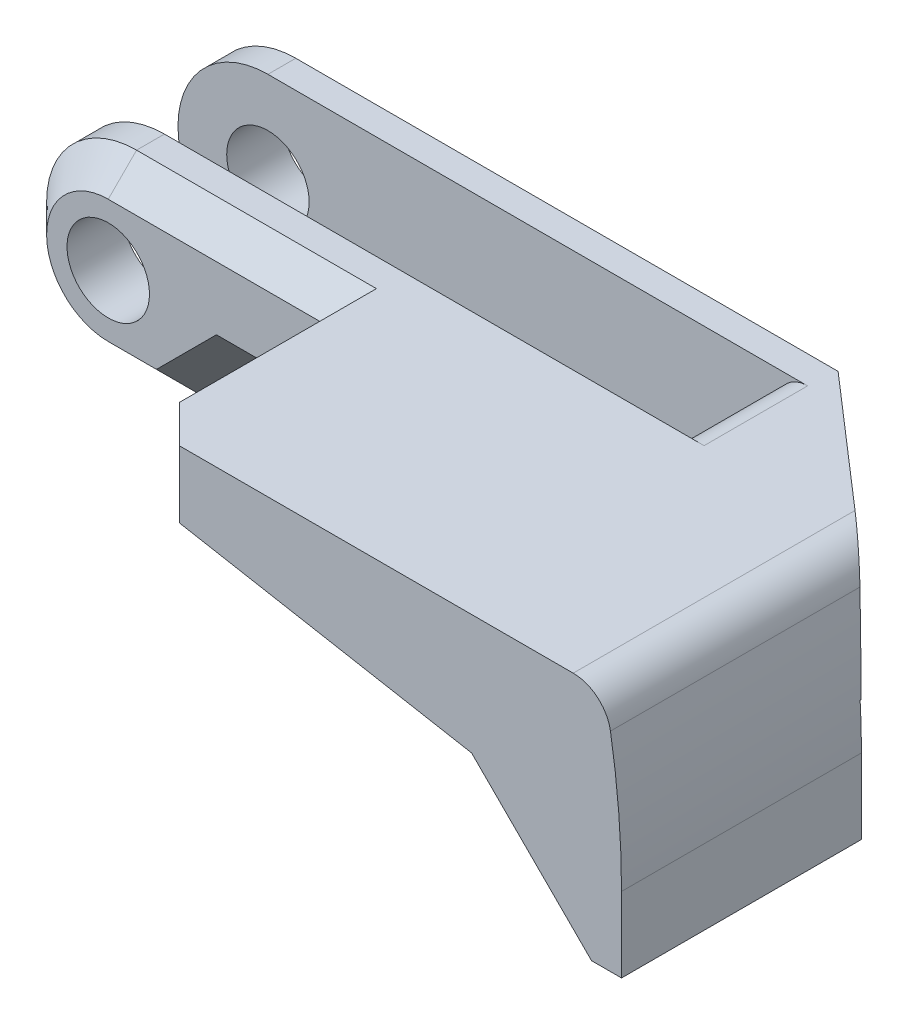
ISO-10303-21;
HEADER;
FILE_DESCRIPTION(('STEP AP214'),'2;1');
FILE_NAME('part.step','',(''),(''),'','','');
FILE_SCHEMA(('AUTOMOTIVE_DESIGN { 1 0 10303 214 1 1 1 1 }'));
ENDSEC;
DATA;
#1=APPLICATION_CONTEXT('core data for automotive mechanical design processes');
#2=APPLICATION_PROTOCOL_DEFINITION('international standard','automotive_design',2000,#1);
#3=PRODUCT_CONTEXT('',#1,'mechanical');
#4=PRODUCT('Part','Part','',(#3));
#5=PRODUCT_RELATED_PRODUCT_CATEGORY('part','',(#4));
#6=PRODUCT_DEFINITION_FORMATION('','',#4);
#7=PRODUCT_DEFINITION_CONTEXT('part definition',#1,'design');
#8=PRODUCT_DEFINITION('design','',#6,#7);
#9=PRODUCT_DEFINITION_SHAPE('','',#8);
#10=(LENGTH_UNIT() NAMED_UNIT(*) SI_UNIT(.MILLI.,.METRE.));
#11=(NAMED_UNIT(*) PLANE_ANGLE_UNIT() SI_UNIT($,.RADIAN.));
#12=(NAMED_UNIT(*) SI_UNIT($,.STERADIAN.) SOLID_ANGLE_UNIT());
#13=UNCERTAINTY_MEASURE_WITH_UNIT(LENGTH_MEASURE(1.E-05),#10,'distance_accuracy_value','');
#14=(GEOMETRIC_REPRESENTATION_CONTEXT(3) GLOBAL_UNCERTAINTY_ASSIGNED_CONTEXT((#13)) GLOBAL_UNIT_ASSIGNED_CONTEXT((#10,
#11,#12)) REPRESENTATION_CONTEXT('',''));
#15=CARTESIAN_POINT('',(0.,0.,0.));
#16=DIRECTION('',(0.,0.,1.));
#17=DIRECTION('',(1.,0.,0.));
#18=AXIS2_PLACEMENT_3D('',#15,#16,#17);
#19=CARTESIAN_POINT('',(0.,0.,11.43));
#20=DIRECTION('',(0.,0.,-1.));
#21=DIRECTION('',(-1.,0.,0.));
#22=AXIS2_PLACEMENT_3D('',#19,#20,#21);
#23=CYLINDRICAL_SURFACE('',#22,4.7625);
#24=CARTESIAN_POINT('',(0.,0.,2.975));
#25=DIRECTION('',(0.,0.,-1.));
#26=DIRECTION('',(-1.,0.,0.));
#27=AXIS2_PLACEMENT_3D('',#24,#25,#26);
#28=CIRCLE('',#27,4.7625);
#29=CARTESIAN_POINT('',(0.,-4.7625,2.975));
#30=VERTEX_POINT('',#29);
#31=CARTESIAN_POINT('',(0.,4.7625,2.975));
#32=VERTEX_POINT('',#31);
#33=EDGE_CURVE('E264',#30,#32,#28,.T.);
#34=ORIENTED_EDGE('',*,*,#33,.T.);
#35=DIRECTION('',(0.,0.,-1.));
#36=VECTOR('',#35,1.);
#37=CARTESIAN_POINT('',(0.,4.7625,11.43));
#38=LINE('',#37,#36);
#39=CARTESIAN_POINT('',(0.,4.7625,1.5));
#40=VERTEX_POINT('',#39);
#41=EDGE_CURVE('E342',#32,#40,#38,.T.);
#42=ORIENTED_EDGE('',*,*,#41,.T.);
#43=CARTESIAN_POINT('',(0.,0.,1.5));
#44=DIRECTION('',(0.,0.,1.));
#45=DIRECTION('',(1.,0.,0.));
#46=AXIS2_PLACEMENT_3D('',#43,#44,#45);
#47=CIRCLE('',#46,4.7625);
#48=CARTESIAN_POINT('',(0.,-4.7625,1.5));
#49=VERTEX_POINT('',#48);
#50=EDGE_CURVE('E426',#40,#49,#47,.T.);
#51=ORIENTED_EDGE('',*,*,#50,.T.);
#52=DIRECTION('',(0.,0.,-1.));
#53=VECTOR('',#52,1.);
#54=CARTESIAN_POINT('',(0.,-4.7625,11.43));
#55=LINE('',#54,#53);
#56=EDGE_CURVE('E358',#30,#49,#55,.T.);
#57=ORIENTED_EDGE('',*,*,#56,.F.);
#58=EDGE_LOOP('',(#34,#42,#51,#57));
#59=FACE_BOUND('',#58,.T.);
#60=ADVANCED_FACE('F34',(#59),#23,.T.);
#61=CARTESIAN_POINT('',(0.,-4.7625,11.43));
#62=DIRECTION('',(0.,1.,0.));
#63=DIRECTION('',(0.,0.,1.));
#64=AXIS2_PLACEMENT_3D('',#61,#62,#63);
#65=PLANE('',#64);
#66=DIRECTION('',(0.,0.,-1.));
#67=VECTOR('',#66,1.);
#68=CARTESIAN_POINT('',(3.175,-4.7625,11.43));
#69=LINE('',#68,#67);
#70=CARTESIAN_POINT('',(3.175,-4.7625,2.975));
#71=VERTEX_POINT('',#70);
#72=CARTESIAN_POINT('',(3.175,-4.7625,1.5));
#73=VERTEX_POINT('',#72);
#74=EDGE_CURVE('E354',#71,#73,#69,.T.);
#75=ORIENTED_EDGE('',*,*,#74,.F.);
#76=DIRECTION('',(-1.,0.,0.));
#77=VECTOR('',#76,1.);
#78=CARTESIAN_POINT('',(0.,-4.7625,2.975));
#79=LINE('',#78,#77);
#80=EDGE_CURVE('E261',#71,#30,#79,.T.);
#81=ORIENTED_EDGE('',*,*,#80,.T.);
#82=ORIENTED_EDGE('',*,*,#56,.T.);
#83=DIRECTION('',(1.,0.,0.));
#84=VECTOR('',#83,1.);
#85=CARTESIAN_POINT('',(0.,-4.7625,1.5));
#86=LINE('',#85,#84);
#87=EDGE_CURVE('E431',#49,#73,#86,.T.);
#88=ORIENTED_EDGE('',*,*,#87,.T.);
#89=EDGE_LOOP('',(#75,#81,#82,#88));
#90=FACE_BOUND('',#89,.T.);
#91=ADVANCED_FACE('F480',(#90),#65,.F.);
#92=CARTESIAN_POINT('',(3.175,-4.7625,11.43));
#93=DIRECTION('',(-0.707106781186548,0.707106781186547,0.));
#94=DIRECTION('',(-0.707106781186547,-0.707106781186548,0.));
#95=AXIS2_PLACEMENT_3D('',#92,#93,#94);
#96=PLANE('',#95);
#97=DIRECTION('',(0.,0.,-1.));
#98=VECTOR('',#97,1.);
#99=CARTESIAN_POINT('',(6.35,-1.5875,11.43));
#100=LINE('',#99,#98);
#101=CARTESIAN_POINT('',(6.35,-1.5875,2.975));
#102=VERTEX_POINT('',#101);
#103=CARTESIAN_POINT('',(6.35,-1.5875,0.));
#104=VERTEX_POINT('',#103);
#105=EDGE_CURVE('E350',#102,#104,#100,.T.);
#106=ORIENTED_EDGE('',*,*,#105,.F.);
#107=DIRECTION('',(-0.707106781186547,-0.707106781186548,0.));
#108=VECTOR('',#107,1.);
#109=CARTESIAN_POINT('',(3.175,-4.7625,2.975));
#110=LINE('',#109,#108);
#111=EDGE_CURVE('E258',#102,#71,#110,.T.);
#112=ORIENTED_EDGE('',*,*,#111,.T.);
#113=ORIENTED_EDGE('',*,*,#74,.T.);
#114=DIRECTION('',(-0.577350269189626,-0.577350269189626,0.577350269189625));
#115=VECTOR('',#114,1.);
#116=CARTESIAN_POINT('',(2.11666666666667,-5.82083333333333,2.55833333333333));
#117=LINE('',#116,#115);
#118=CARTESIAN_POINT('',(4.675,-3.2625,0.));
#119=VERTEX_POINT('',#118);
#120=EDGE_CURVE('E436',#73,#119,#117,.F.);
#121=ORIENTED_EDGE('',*,*,#120,.T.);
#122=DIRECTION('',(0.707106781186547,0.707106781186548,0.));
#123=VECTOR('',#122,1.);
#124=CARTESIAN_POINT('',(3.175,-4.7625,0.));
#125=LINE('',#124,#123);
#126=EDGE_CURVE('E335',#119,#104,#125,.T.);
#127=ORIENTED_EDGE('',*,*,#126,.T.);
#128=EDGE_LOOP('',(#106,#112,#113,#121,#127));
#129=FACE_BOUND('',#128,.T.);
#130=ADVANCED_FACE('F497',(#129),#96,.F.);
#131=CARTESIAN_POINT('',(0.,0.,11.43));
#132=DIRECTION('',(0.,0.,1.));
#133=DIRECTION('',(1.,0.,0.));
#134=AXIS2_PLACEMENT_3D('',#131,#132,#133);
#135=CYLINDRICAL_SURFACE('',#134,2.182876);
#136=CARTESIAN_POINT('',(0.,0.,2.975));
#137=DIRECTION('',(0.,0.,-1.));
#138=DIRECTION('',(-1.,0.,0.));
#139=AXIS2_PLACEMENT_3D('',#136,#137,#138);
#140=CIRCLE('',#139,2.182876);
#141=CARTESIAN_POINT('',(-2.182876,0.,2.975));
#142=VERTEX_POINT('',#141);
#143=EDGE_CURVE('E257',#142,#142,#140,.F.);
#144=ORIENTED_EDGE('',*,*,#143,.T.);
#145=EDGE_LOOP('',(#144));
#146=FACE_BOUND('',#145,.T.);
#147=CARTESIAN_POINT('',(0.,0.,0.));
#148=DIRECTION('',(0.,0.,1.));
#149=DIRECTION('',(1.,0.,0.));
#150=AXIS2_PLACEMENT_3D('',#147,#148,#149);
#151=CIRCLE('',#150,2.182876);
#152=CARTESIAN_POINT('',(2.182876,0.,0.));
#153=VERTEX_POINT('',#152);
#154=EDGE_CURVE('E322',#153,#153,#151,.T.);
#155=ORIENTED_EDGE('',*,*,#154,.F.);
#156=EDGE_LOOP('',(#155));
#157=FACE_BOUND('',#156,.T.);
#158=ADVANCED_FACE('F623',(#146,#157),#135,.F.);
#159=CARTESIAN_POINT('',(38.1,4.7625,11.43));
#160=DIRECTION('',(-1.,0.,0.));
#161=DIRECTION('',(0.,0.,1.));
#162=AXIS2_PLACEMENT_3D('',#159,#160,#161);
#163=PLANE('',#162);
#164=DIRECTION('',(0.,1.,0.));
#165=VECTOR('',#164,1.);
#166=CARTESIAN_POINT('',(38.1,-7.9375,22.352));
#167=LINE('',#166,#165);
#168=CARTESIAN_POINT('',(38.1,-7.9375,22.352));
#169=VERTEX_POINT('',#168);
#170=CARTESIAN_POINT('',(38.1,-3.96875,22.352));
#171=VERTEX_POINT('',#170);
#172=EDGE_CURVE('E285',#169,#171,#167,.T.);
#173=ORIENTED_EDGE('',*,*,#172,.F.);
#174=DIRECTION('',(0.,0.,-1.));
#175=VECTOR('',#174,1.);
#176=CARTESIAN_POINT('',(38.1,-7.9375,11.43));
#177=LINE('',#176,#175);
#178=CARTESIAN_POINT('',(38.1,-7.9375,9.652));
#179=VERTEX_POINT('',#178);
#180=EDGE_CURVE('E346',#169,#179,#177,.T.);
#181=ORIENTED_EDGE('',*,*,#180,.T.);
#182=DIRECTION('',(0.,-1.,0.));
#183=VECTOR('',#182,1.);
#184=CARTESIAN_POINT('',(38.1,-3.96875,9.652));
#185=LINE('',#184,#183);
#186=CARTESIAN_POINT('',(38.1,-3.96874999999999,9.652));
#187=VERTEX_POINT('',#186);
#188=EDGE_CURVE('E301',#187,#179,#185,.T.);
#189=ORIENTED_EDGE('',*,*,#188,.F.);
#190=DIRECTION('',(0.,0.,-1.));
#191=VECTOR('',#190,1.);
#192=CARTESIAN_POINT('',(38.1,-3.96875,24.13));
#193=LINE('',#192,#191);
#194=EDGE_CURVE('E339',#171,#187,#193,.T.);
#195=ORIENTED_EDGE('',*,*,#194,.F.);
#196=EDGE_LOOP('',(#173,#181,#189,#195));
#197=FACE_BOUND('',#196,.T.);
#198=ADVANCED_FACE('F565',(#197),#163,.F.);
#199=CARTESIAN_POINT('',(36.5125,-7.9375,11.43));
#200=DIRECTION('',(0.707106781186547,0.707106781186547,0.));
#201=DIRECTION('',(-0.707106781186548,0.707106781186548,0.));
#202=AXIS2_PLACEMENT_3D('',#199,#200,#201);
#203=PLANE('',#202);
#204=DIRECTION('',(0.707106781186547,-0.707106781186547,0.));
#205=VECTOR('',#204,1.);
#206=CARTESIAN_POINT('',(30.1625,-1.5875,22.352));
#207=LINE('',#206,#205);
#208=CARTESIAN_POINT('',(30.1625,-1.5875,22.352));
#209=VERTEX_POINT('',#208);
#210=CARTESIAN_POINT('',(36.5125,-7.9375,22.352));
#211=VERTEX_POINT('',#210);
#212=EDGE_CURVE('E297',#209,#211,#207,.T.);
#213=ORIENTED_EDGE('',*,*,#212,.F.);
#214=DIRECTION('',(0.,0.,-1.));
#215=VECTOR('',#214,1.);
#216=CARTESIAN_POINT('',(30.1625,-1.5875,24.13));
#217=LINE('',#216,#215);
#218=CARTESIAN_POINT('',(30.1625,-1.5875,9.92999999999999));
#219=VERTEX_POINT('',#218);
#220=EDGE_CURVE('E330',#209,#219,#217,.T.);
#221=ORIENTED_EDGE('',*,*,#220,.T.);
#222=DIRECTION('',(0.,0.,1.));
#223=VECTOR('',#222,1.);
#224=CARTESIAN_POINT('',(30.1625,-1.5875,9.652));
#225=LINE('',#224,#223);
#226=CARTESIAN_POINT('',(30.1625,-1.5875,9.652));
#227=VERTEX_POINT('',#226);
#228=EDGE_CURVE('E315',#227,#219,#225,.T.);
#229=ORIENTED_EDGE('',*,*,#228,.F.);
#230=DIRECTION('',(-0.707106781186548,0.707106781186547,0.));
#231=VECTOR('',#230,1.);
#232=CARTESIAN_POINT('',(36.5125,-7.9375,9.652));
#233=LINE('',#232,#231);
#234=CARTESIAN_POINT('',(36.5125,-7.9375,9.652));
#235=VERTEX_POINT('',#234);
#236=EDGE_CURVE('E307',#235,#227,#233,.T.);
#237=ORIENTED_EDGE('',*,*,#236,.F.);
#238=DIRECTION('',(0.,0.,-1.));
#239=VECTOR('',#238,1.);
#240=CARTESIAN_POINT('',(36.5125,-7.9375,11.43));
#241=LINE('',#240,#239);
#242=EDGE_CURVE('E348',#211,#235,#241,.T.);
#243=ORIENTED_EDGE('',*,*,#242,.F.);
#244=EDGE_LOOP('',(#213,#221,#229,#237,#243));
#245=FACE_BOUND('',#244,.T.);
#246=ADVANCED_FACE('F549',(#245),#203,.F.);
#247=CARTESIAN_POINT('',(38.1,-7.9375,11.43));
#248=DIRECTION('',(0.,1.,0.));
#249=DIRECTION('',(0.,0.,1.));
#250=AXIS2_PLACEMENT_3D('',#247,#248,#249);
#251=PLANE('',#250);
#252=DIRECTION('',(1.,0.,0.));
#253=VECTOR('',#252,1.);
#254=CARTESIAN_POINT('',(36.5125,-7.9375,22.352));
#255=LINE('',#254,#253);
#256=EDGE_CURVE('E283',#211,#169,#255,.T.);
#257=ORIENTED_EDGE('',*,*,#256,.F.);
#258=ORIENTED_EDGE('',*,*,#242,.T.);
#259=DIRECTION('',(-1.,0.,0.));
#260=VECTOR('',#259,1.);
#261=CARTESIAN_POINT('',(38.1,-7.9375,9.652));
#262=LINE('',#261,#260);
#263=EDGE_CURVE('E304',#179,#235,#262,.T.);
#264=ORIENTED_EDGE('',*,*,#263,.F.);
#265=ORIENTED_EDGE('',*,*,#180,.F.);
#266=EDGE_LOOP('',(#257,#258,#264,#265));
#267=FACE_BOUND('',#266,.T.);
#268=ADVANCED_FACE('F570',(#267),#251,.F.);
#269=CARTESIAN_POINT('',(0.,4.7625,11.43));
#270=DIRECTION('',(0.,-1.,0.));
#271=DIRECTION('',(0.,0.,-1.));
#272=AXIS2_PLACEMENT_3D('',#269,#270,#271);
#273=PLANE('',#272);
#274=DIRECTION('',(0.,0.,-1.));
#275=VECTOR('',#274,1.);
#276=CARTESIAN_POINT('',(12.7,4.7625,24.13));
#277=LINE('',#276,#275);
#278=CARTESIAN_POINT('',(12.7,4.7625,20.352));
#279=VERTEX_POINT('',#278);
#280=CARTESIAN_POINT('',(12.7,4.7625,9.92999999999999));
#281=VERTEX_POINT('',#280);
#282=EDGE_CURVE('E334',#279,#281,#277,.T.);
#283=ORIENTED_EDGE('',*,*,#282,.F.);
#284=DIRECTION('',(-0.707106781186546,0.,-0.707106781186549));
#285=VECTOR('',#284,1.);
#286=CARTESIAN_POINT('',(14.7,4.7625,22.352));
#287=LINE('',#286,#285);
#288=CARTESIAN_POINT('',(14.7,4.7625,22.352));
#289=VERTEX_POINT('',#288);
#290=EDGE_CURVE('E11',#279,#289,#287,.F.);
#291=ORIENTED_EDGE('',*,*,#290,.T.);
#292=DIRECTION('',(-1.,0.,0.));
#293=VECTOR('',#292,1.);
#294=CARTESIAN_POINT('',(35.541769993234,4.7625,22.352));
#295=LINE('',#294,#293);
#296=CARTESIAN_POINT('',(35.541769993234,4.7625,22.352));
#297=VERTEX_POINT('',#296);
#298=EDGE_CURVE('E292',#297,#289,#295,.T.);
#299=ORIENTED_EDGE('',*,*,#298,.F.);
#300=DIRECTION('',(0.,0.,-1.));
#301=VECTOR('',#300,1.);
#302=CARTESIAN_POINT('',(35.541769993234,4.7625,11.43));
#303=LINE('',#302,#301);
#304=CARTESIAN_POINT('',(35.541769993234,4.7625,7.42999450840892));
#305=VERTEX_POINT('',#304);
#306=EDGE_CURVE('E362',#297,#305,#303,.T.);
#307=ORIENTED_EDGE('',*,*,#306,.T.);
#308=DIRECTION('',(0.754976910693908,0.,0.655751373859852));
#309=VECTOR('',#308,1.);
#310=CARTESIAN_POINT('',(26.9875,4.7625,0.));
#311=LINE('',#310,#309);
#312=CARTESIAN_POINT('',(28.7144736842105,4.7625,1.49999999999999));
#313=VERTEX_POINT('',#312);
#314=EDGE_CURVE('E269',#313,#305,#311,.T.);
#315=ORIENTED_EDGE('',*,*,#314,.F.);
#316=DIRECTION('',(-1.,0.,0.));
#317=VECTOR('',#316,1.);
#318=CARTESIAN_POINT('',(0.,4.7625,1.5));
#319=LINE('',#318,#317);
#320=EDGE_CURVE('E420',#313,#40,#319,.T.);
#321=ORIENTED_EDGE('',*,*,#320,.T.);
#322=ORIENTED_EDGE('',*,*,#41,.F.);
#323=DIRECTION('',(-1.,0.,0.));
#324=VECTOR('',#323,1.);
#325=CARTESIAN_POINT('',(-4.7625,4.7625,2.975));
#326=LINE('',#325,#324);
#327=CARTESIAN_POINT('',(28.575,4.7625,2.975));
#328=VERTEX_POINT('',#327);
#329=EDGE_CURVE('E237',#328,#32,#326,.T.);
#330=ORIENTED_EDGE('',*,*,#329,.F.);
#331=DIRECTION('',(0.,0.,-1.));
#332=VECTOR('',#331,1.);
#333=CARTESIAN_POINT('',(28.575,4.7625,11.43));
#334=LINE('',#333,#332);
#335=CARTESIAN_POINT('',(28.575,4.7625,8.455));
#336=VERTEX_POINT('',#335);
#337=EDGE_CURVE('E381',#328,#336,#334,.F.);
#338=ORIENTED_EDGE('',*,*,#337,.T.);
#339=DIRECTION('',(1.,0.,0.));
#340=VECTOR('',#339,1.);
#341=CARTESIAN_POINT('',(-4.7625,4.7625,8.455));
#342=LINE('',#341,#340);
#343=CARTESIAN_POINT('',(0.,4.7625,8.455));
#344=VERTEX_POINT('',#343);
#345=EDGE_CURVE('E233',#344,#336,#342,.T.);
#346=ORIENTED_EDGE('',*,*,#345,.F.);
#347=CARTESIAN_POINT('',(0.,4.7625,9.92999999999999));
#348=VERTEX_POINT('',#347);
#349=EDGE_CURVE('E343',#348,#344,#38,.T.);
#350=ORIENTED_EDGE('',*,*,#349,.F.);
#351=DIRECTION('',(1.,0.,0.));
#352=VECTOR('',#351,1.);
#353=CARTESIAN_POINT('',(12.7,4.7625,9.92999999999999));
#354=LINE('',#353,#352);
#355=EDGE_CURVE('E423',#348,#281,#354,.T.);
#356=ORIENTED_EDGE('',*,*,#355,.T.);
#357=EDGE_LOOP('',(#283,#291,#299,#307,#315,#321,#322,#330,#338,#346,#350,#356));
#358=FACE_BOUND('',#357,.T.);
#359=ADVANCED_FACE('F486',(#358),#273,.F.);
#360=CARTESIAN_POINT('',(-4.7625,-3.96875,24.13));
#361=DIRECTION('',(0.,0.,-1.));
#362=DIRECTION('',(-1.,0.,0.));
#363=AXIS2_PLACEMENT_3D('',#360,#361,#362);
#364=CYLINDRICAL_SURFACE('',#363,42.8625);
#365=DIRECTION('',(0.,0.,1.));
#366=VECTOR('',#365,1.);
#367=CARTESIAN_POINT('',(38.0338030492997,-1.5875,0.));
#368=LINE('',#367,#366);
#369=CARTESIAN_POINT('',(38.0338030492997,-1.5875,9.59450321996317));
#370=VERTEX_POINT('',#369);
#371=CARTESIAN_POINT('',(38.0338030492997,-1.5875,9.652));
#372=VERTEX_POINT('',#371);
#373=EDGE_CURVE('E299',#370,#372,#368,.T.);
#374=ORIENTED_EDGE('',*,*,#373,.F.);
#375=CARTESIAN_POINT('',(-4.7625,-3.96875,-27.5771428571429));
#376=DIRECTION('',(-0.655751373859851,0.,0.754976910693908));
#377=DIRECTION('',(-0.754976910693908,0.,-0.655751373859852));
#378=AXIS2_PLACEMENT_3D('',#375,#376,#377);
#379=ELLIPSE('',#378,56.7732594108137,42.8625);
#380=CARTESIAN_POINT('',(37.5144476313243,3.0919585500153,9.14340594263599));
#381=VERTEX_POINT('',#380);
#382=EDGE_CURVE('E278',#370,#381,#379,.T.);
#383=ORIENTED_EDGE('',*,*,#382,.T.);
#384=DIRECTION('',(0.,0.,-1.));
#385=VECTOR('',#384,1.);
#386=CARTESIAN_POINT('',(37.5144476313243,3.0919585500153,24.13));
#387=LINE('',#386,#385);
#388=CARTESIAN_POINT('',(37.5144476313243,3.0919585500153,22.352));
#389=VERTEX_POINT('',#388);
#390=EDGE_CURVE('E407',#381,#389,#387,.F.);
#391=ORIENTED_EDGE('',*,*,#390,.T.);
#392=CARTESIAN_POINT('',(-4.7625,-3.96875,22.352));
#393=DIRECTION('',(0.,0.,1.));
#394=DIRECTION('',(1.,0.,0.));
#395=AXIS2_PLACEMENT_3D('',#392,#393,#394);
#396=CIRCLE('',#395,42.8625);
#397=EDGE_CURVE('E287',#171,#389,#396,.T.);
#398=ORIENTED_EDGE('',*,*,#397,.F.);
#399=ORIENTED_EDGE('',*,*,#194,.T.);
#400=CARTESIAN_POINT('',(-4.7625,-3.96875,9.652));
#401=DIRECTION('',(0.,0.,-1.));
#402=DIRECTION('',(-1.,0.,0.));
#403=AXIS2_PLACEMENT_3D('',#400,#401,#402);
#404=CIRCLE('',#403,42.8625);
#405=EDGE_CURVE('E312',#372,#187,#404,.T.);
#406=ORIENTED_EDGE('',*,*,#405,.F.);
#407=EDGE_LOOP('',(#374,#383,#391,#398,#399,#406));
#408=FACE_BOUND('',#407,.T.);
#409=ADVANCED_FACE('F560',(#408),#364,.T.);
#410=CARTESIAN_POINT('',(12.7,0.,24.13));
#411=DIRECTION('',(-1.,0.,0.));
#412=DIRECTION('',(0.,0.,1.));
#413=AXIS2_PLACEMENT_3D('',#410,#411,#412);
#414=PLANE('',#413);
#415=DIRECTION('',(0.,0.,-1.));
#416=VECTOR('',#415,1.);
#417=CARTESIAN_POINT('',(12.7,1.5875,24.13));
#418=LINE('',#417,#416);
#419=CARTESIAN_POINT('',(12.7,1.5875,20.352));
#420=VERTEX_POINT('',#419);
#421=CARTESIAN_POINT('',(12.7,1.5875,11.43));
#422=VERTEX_POINT('',#421);
#423=EDGE_CURVE('E332',#420,#422,#418,.T.);
#424=ORIENTED_EDGE('',*,*,#423,.F.);
#425=DIRECTION('',(0.,1.,0.));
#426=VECTOR('',#425,1.);
#427=CARTESIAN_POINT('',(12.7,0.,20.352));
#428=LINE('',#427,#426);
#429=EDGE_CURVE('E42',#420,#279,#428,.T.);
#430=ORIENTED_EDGE('',*,*,#429,.T.);
#431=ORIENTED_EDGE('',*,*,#282,.T.);
#432=DIRECTION('',(0.,-0.707106781186546,0.707106781186549));
#433=VECTOR('',#432,1.);
#434=CARTESIAN_POINT('',(12.7,3.2625,11.43));
#435=LINE('',#434,#433);
#436=CARTESIAN_POINT('',(12.7,3.2625,11.43));
#437=VERTEX_POINT('',#436);
#438=EDGE_CURVE('E449',#281,#437,#435,.T.);
#439=ORIENTED_EDGE('',*,*,#438,.T.);
#440=DIRECTION('',(0.,1.,0.));
#441=VECTOR('',#440,1.);
#442=CARTESIAN_POINT('',(12.7,0.,11.43));
#443=LINE('',#442,#441);
#444=EDGE_CURVE('E326',#422,#437,#443,.T.);
#445=ORIENTED_EDGE('',*,*,#444,.F.);
#446=EDGE_LOOP('',(#424,#430,#431,#439,#445));
#447=FACE_BOUND('',#446,.T.);
#448=ADVANCED_FACE('F670',(#447),#414,.T.);
#449=CARTESIAN_POINT('',(0.685799999999998,3.7719,24.13));
#450=DIRECTION('',(-0.178885438199983,-0.983869910099908,0.));
#451=DIRECTION('',(0.983869910099908,-0.178885438199983,0.));
#452=AXIS2_PLACEMENT_3D('',#449,#450,#451);
#453=PLANE('',#452);
#454=DIRECTION('',(0.983869910099908,-0.178885438199983,0.));
#455=VECTOR('',#454,1.);
#456=CARTESIAN_POINT('',(12.7,1.5875,22.352));
#457=LINE('',#456,#455);
#458=CARTESIAN_POINT('',(14.7,1.22386363636364,22.352));
#459=VERTEX_POINT('',#458);
#460=EDGE_CURVE('E295',#459,#209,#457,.T.);
#461=ORIENTED_EDGE('',*,*,#460,.F.);
#462=DIRECTION('',(0.701334384369671,-0.127515342612667,0.701334384369674));
#463=VECTOR('',#462,1.);
#464=CARTESIAN_POINT('',(8.45350813008132,2.3595894308943,16.1055081300813));
#465=LINE('',#464,#463);
#466=EDGE_CURVE('E56',#459,#420,#465,.F.);
#467=ORIENTED_EDGE('',*,*,#466,.T.);
#468=ORIENTED_EDGE('',*,*,#423,.T.);
#469=DIRECTION('',(-0.983869910099908,0.178885438199983,0.));
#470=VECTOR('',#469,1.);
#471=CARTESIAN_POINT('',(0.685799999999998,3.7719,11.43));
#472=LINE('',#471,#470);
#473=CARTESIAN_POINT('',(21.9125,-0.087499999999999,11.43));
#474=VERTEX_POINT('',#473);
#475=EDGE_CURVE('E327',#474,#422,#472,.T.);
#476=ORIENTED_EDGE('',*,*,#475,.F.);
#477=DIRECTION('',(0.968495996958186,-0.176090181265124,-0.176090181265125));
#478=VECTOR('',#477,1.);
#479=CARTESIAN_POINT('',(1.35891472868217,3.64951550387596,15.167015503876));
#480=LINE('',#479,#478);
#481=EDGE_CURVE('E378',#474,#219,#480,.T.);
#482=ORIENTED_EDGE('',*,*,#481,.T.);
#483=ORIENTED_EDGE('',*,*,#220,.F.);
#484=EDGE_LOOP('',(#461,#467,#468,#476,#482,#483));
#485=FACE_BOUND('',#484,.T.);
#486=ADVANCED_FACE('F543',(#485),#453,.T.);
#487=CARTESIAN_POINT('',(35.541769993234,2.7625,24.13));
#488=DIRECTION('',(0.,0.,-1.));
#489=DIRECTION('',(-1.,0.,0.));
#490=AXIS2_PLACEMENT_3D('',#487,#488,#489);
#491=CYLINDRICAL_SURFACE('',#490,2.);
#492=CARTESIAN_POINT('',(35.541769993234,2.7625,7.42999450840892));
#493=DIRECTION('',(-0.655751373859851,0.,0.754976910693908));
#494=DIRECTION('',(-0.754976910693908,0.,-0.655751373859852));
#495=AXIS2_PLACEMENT_3D('',#492,#493,#494);
#496=ELLIPSE('',#495,2.64908763655007,2.);
#497=EDGE_CURVE('E281',#305,#381,#496,.F.);
#498=ORIENTED_EDGE('',*,*,#497,.F.);
#499=ORIENTED_EDGE('',*,*,#306,.F.);
#500=CARTESIAN_POINT('',(35.541769993234,2.7625,22.352));
#501=DIRECTION('',(0.,0.,1.));
#502=DIRECTION('',(1.,0.,0.));
#503=AXIS2_PLACEMENT_3D('',#500,#501,#502);
#504=CIRCLE('',#503,2.);
#505=EDGE_CURVE('E290',#389,#297,#504,.T.);
#506=ORIENTED_EDGE('',*,*,#505,.F.);
#507=ORIENTED_EDGE('',*,*,#390,.F.);
#508=EDGE_LOOP('',(#498,#499,#506,#507));
#509=FACE_BOUND('',#508,.T.);
#510=ADVANCED_FACE('F576',(#509),#491,.T.);
#511=CARTESIAN_POINT('',(6.35,-1.5875,11.43));
#512=DIRECTION('',(0.,1.,0.));
#513=DIRECTION('',(-1.,0.,0.));
#514=AXIS2_PLACEMENT_3D('',#511,#512,#513);
#515=PLANE('',#514);
#516=DIRECTION('',(0.,0.,-1.));
#517=VECTOR('',#516,1.);
#518=CARTESIAN_POINT('',(28.575,-1.5875,11.43));
#519=LINE('',#518,#517);
#520=CARTESIAN_POINT('',(28.575,-1.5875,8.455));
#521=VERTEX_POINT('',#520);
#522=CARTESIAN_POINT('',(28.575,-1.5875,2.975));
#523=VERTEX_POINT('',#522);
#524=EDGE_CURVE('E384',#521,#523,#519,.T.);
#525=ORIENTED_EDGE('',*,*,#524,.T.);
#526=DIRECTION('',(-1.,0.,0.));
#527=VECTOR('',#526,1.);
#528=CARTESIAN_POINT('',(6.35,-1.5875,2.975));
#529=LINE('',#528,#527);
#530=EDGE_CURVE('E266',#523,#102,#529,.T.);
#531=ORIENTED_EDGE('',*,*,#530,.T.);
#532=ORIENTED_EDGE('',*,*,#105,.T.);
#533=DIRECTION('',(1.,0.,0.));
#534=VECTOR('',#533,1.);
#535=CARTESIAN_POINT('',(6.35,-1.5875,0.));
#536=LINE('',#535,#534);
#537=CARTESIAN_POINT('',(26.9875,-1.5875,0.));
#538=VERTEX_POINT('',#537);
#539=EDGE_CURVE('E338',#104,#538,#536,.T.);
#540=ORIENTED_EDGE('',*,*,#539,.T.);
#541=DIRECTION('',(0.754976910693908,0.,0.655751373859852));
#542=VECTOR('',#541,1.);
#543=CARTESIAN_POINT('',(20.8830603584656,-1.5875,-5.30214186007557));
#544=LINE('',#543,#542);
#545=EDGE_CURVE('E275',#538,#370,#544,.T.);
#546=ORIENTED_EDGE('',*,*,#545,.T.);
#547=ORIENTED_EDGE('',*,*,#373,.T.);
#548=DIRECTION('',(1.,0.,0.));
#549=VECTOR('',#548,1.);
#550=CARTESIAN_POINT('',(30.1625,-1.5875,9.652));
#551=LINE('',#550,#549);
#552=EDGE_CURVE('E309',#227,#372,#551,.T.);
#553=ORIENTED_EDGE('',*,*,#552,.F.);
#554=ORIENTED_EDGE('',*,*,#228,.T.);
#555=DIRECTION('',(-1.,0.,0.));
#556=VECTOR('',#555,1.);
#557=CARTESIAN_POINT('',(6.35,-1.5875,9.92999999999999));
#558=LINE('',#557,#556);
#559=CARTESIAN_POINT('',(6.35,-1.5875,9.92999999999999));
#560=VERTEX_POINT('',#559);
#561=EDGE_CURVE('E440',#219,#560,#558,.T.);
#562=ORIENTED_EDGE('',*,*,#561,.T.);
#563=CARTESIAN_POINT('',(6.35,-1.5875,8.455));
#564=VERTEX_POINT('',#563);
#565=EDGE_CURVE('E351',#560,#564,#100,.T.);
#566=ORIENTED_EDGE('',*,*,#565,.T.);
#567=DIRECTION('',(1.,0.,0.));
#568=VECTOR('',#567,1.);
#569=CARTESIAN_POINT('',(6.35,-1.5875,8.455));
#570=LINE('',#569,#568);
#571=EDGE_CURVE('E255',#564,#521,#570,.T.);
#572=ORIENTED_EDGE('',*,*,#571,.T.);
#573=EDGE_LOOP('',(#525,#531,#532,#540,#546,#547,#553,#554,#562,#566,#572));
#574=FACE_BOUND('',#573,.T.);
#575=ADVANCED_FACE('F502',(#574),#515,.F.);
#576=CARTESIAN_POINT('',(0.,0.,11.43));
#577=DIRECTION('',(0.,0.,1.));
#578=DIRECTION('',(1.,0.,0.));
#579=AXIS2_PLACEMENT_3D('',#576,#577,#578);
#580=PLANE('',#579);
#581=CARTESIAN_POINT('',(0.,0.,11.43));
#582=DIRECTION('',(0.,0.,1.));
#583=DIRECTION('',(1.,0.,0.));
#584=AXIS2_PLACEMENT_3D('',#581,#582,#583);
#585=CIRCLE('',#584,2.182876);
#586=CARTESIAN_POINT('',(2.182876,0.,11.43));
#587=VERTEX_POINT('',#586);
#588=EDGE_CURVE('E319',#587,#587,#585,.T.);
#589=ORIENTED_EDGE('',*,*,#588,.F.);
#590=EDGE_LOOP('',(#589));
#591=FACE_BOUND('',#590,.T.);
#592=ORIENTED_EDGE('',*,*,#444,.T.);
#593=DIRECTION('',(-1.,0.,0.));
#594=VECTOR('',#593,1.);
#595=CARTESIAN_POINT('',(0.,3.2625,11.43));
#596=LINE('',#595,#594);
#597=CARTESIAN_POINT('',(0.,3.2625,11.43));
#598=VERTEX_POINT('',#597);
#599=EDGE_CURVE('E417',#437,#598,#596,.T.);
#600=ORIENTED_EDGE('',*,*,#599,.T.);
#601=CARTESIAN_POINT('',(0.,0.,11.43));
#602=DIRECTION('',(0.,0.,1.));
#603=DIRECTION('',(1.,0.,0.));
#604=AXIS2_PLACEMENT_3D('',#601,#602,#603);
#605=CIRCLE('',#604,3.2625);
#606=CARTESIAN_POINT('',(0.,-3.2625,11.43));
#607=VERTEX_POINT('',#606);
#608=EDGE_CURVE('E415',#598,#607,#605,.T.);
#609=ORIENTED_EDGE('',*,*,#608,.T.);
#610=DIRECTION('',(1.,0.,0.));
#611=VECTOR('',#610,1.);
#612=CARTESIAN_POINT('',(3.175,-3.2625,11.43));
#613=LINE('',#612,#611);
#614=CARTESIAN_POINT('',(2.55367965644036,-3.2625,11.43));
#615=VERTEX_POINT('',#614);
#616=EDGE_CURVE('E413',#607,#615,#613,.T.);
#617=ORIENTED_EDGE('',*,*,#616,.T.);
#618=DIRECTION('',(0.707106781186547,0.707106781186548,0.));
#619=VECTOR('',#618,1.);
#620=CARTESIAN_POINT('',(5.28933982822018,-0.526839828220177,11.43));
#621=LINE('',#620,#619);
#622=CARTESIAN_POINT('',(5.72867965644036,-0.0874999999999982,11.43));
#623=VERTEX_POINT('',#622);
#624=EDGE_CURVE('E411',#615,#623,#621,.T.);
#625=ORIENTED_EDGE('',*,*,#624,.T.);
#626=DIRECTION('',(1.,0.,0.));
#627=VECTOR('',#626,1.);
#628=CARTESIAN_POINT('',(30.1625,-0.0874999999999973,11.43));
#629=LINE('',#628,#627);
#630=EDGE_CURVE('E409',#623,#474,#629,.T.);
#631=ORIENTED_EDGE('',*,*,#630,.T.);
#632=ORIENTED_EDGE('',*,*,#475,.T.);
#633=EDGE_LOOP('',(#592,#600,#609,#617,#625,#631,#632));
#634=FACE_BOUND('',#633,.T.);
#635=ADVANCED_FACE('F597',(#591,#634),#580,.T.);
#636=ORIENTED_EDGE('',*,*,#349,.T.);
#637=CARTESIAN_POINT('',(0.,0.,8.455));
#638=DIRECTION('',(0.,0.,1.));
#639=DIRECTION('',(1.,0.,0.));
#640=AXIS2_PLACEMENT_3D('',#637,#638,#639);
#641=CIRCLE('',#640,4.7625);
#642=CARTESIAN_POINT('',(0.,-4.7625,8.455));
#643=VERTEX_POINT('',#642);
#644=EDGE_CURVE('E253',#344,#643,#641,.T.);
#645=ORIENTED_EDGE('',*,*,#644,.T.);
#646=CARTESIAN_POINT('',(0.,-4.7625,9.92999999999999));
#647=VERTEX_POINT('',#646);
#648=EDGE_CURVE('E359',#647,#643,#55,.T.);
#649=ORIENTED_EDGE('',*,*,#648,.F.);
#650=CARTESIAN_POINT('',(0.,0.,9.92999999999999));
#651=DIRECTION('',(0.,0.,1.));
#652=DIRECTION('',(1.,0.,0.));
#653=AXIS2_PLACEMENT_3D('',#650,#651,#652);
#654=CIRCLE('',#653,4.7625);
#655=EDGE_CURVE('E429',#647,#348,#654,.F.);
#656=ORIENTED_EDGE('',*,*,#655,.T.);
#657=EDGE_LOOP('',(#636,#645,#649,#656));
#658=FACE_BOUND('',#657,.T.);
#659=ADVANCED_FACE('F522',(#658),#23,.T.);
#660=ORIENTED_EDGE('',*,*,#648,.T.);
#661=DIRECTION('',(1.,0.,0.));
#662=VECTOR('',#661,1.);
#663=CARTESIAN_POINT('',(0.,-4.7625,8.455));
#664=LINE('',#663,#662);
#665=CARTESIAN_POINT('',(3.175,-4.7625,8.455));
#666=VERTEX_POINT('',#665);
#667=EDGE_CURVE('E250',#643,#666,#664,.T.);
#668=ORIENTED_EDGE('',*,*,#667,.T.);
#669=CARTESIAN_POINT('',(3.175,-4.7625,9.92999999999999));
#670=VERTEX_POINT('',#669);
#671=EDGE_CURVE('E355',#670,#666,#69,.T.);
#672=ORIENTED_EDGE('',*,*,#671,.F.);
#673=DIRECTION('',(-1.,0.,0.));
#674=VECTOR('',#673,1.);
#675=CARTESIAN_POINT('',(0.,-4.7625,9.92999999999999));
#676=LINE('',#675,#674);
#677=EDGE_CURVE('E434',#670,#647,#676,.T.);
#678=ORIENTED_EDGE('',*,*,#677,.T.);
#679=EDGE_LOOP('',(#660,#668,#672,#678));
#680=FACE_BOUND('',#679,.T.);
#681=ADVANCED_FACE('F594',(#680),#65,.F.);
#682=ORIENTED_EDGE('',*,*,#671,.T.);
#683=DIRECTION('',(0.707106781186547,0.707106781186548,0.));
#684=VECTOR('',#683,1.);
#685=CARTESIAN_POINT('',(3.175,-4.7625,8.455));
#686=LINE('',#685,#684);
#687=EDGE_CURVE('E247',#666,#564,#686,.T.);
#688=ORIENTED_EDGE('',*,*,#687,.T.);
#689=ORIENTED_EDGE('',*,*,#565,.F.);
#690=DIRECTION('',(-0.707106781186547,-0.707106781186548,0.));
#691=VECTOR('',#690,1.);
#692=CARTESIAN_POINT('',(3.175,-4.7625,9.92999999999999));
#693=LINE('',#692,#691);
#694=EDGE_CURVE('E438',#560,#670,#693,.T.);
#695=ORIENTED_EDGE('',*,*,#694,.T.);
#696=EDGE_LOOP('',(#682,#688,#689,#695));
#697=FACE_BOUND('',#696,.T.);
#698=ADVANCED_FACE('F602',(#697),#96,.F.);
#699=CARTESIAN_POINT('',(0.,0.,0.));
#700=DIRECTION('',(0.,0.,1.));
#701=DIRECTION('',(1.,0.,0.));
#702=AXIS2_PLACEMENT_3D('',#699,#700,#701);
#703=PLANE('',#702);
#704=ORIENTED_EDGE('',*,*,#154,.T.);
#705=EDGE_LOOP('',(#704));
#706=FACE_BOUND('',#705,.T.);
#707=DIRECTION('',(1.,0.,0.));
#708=VECTOR('',#707,1.);
#709=CARTESIAN_POINT('',(0.,3.2625,0.));
#710=LINE('',#709,#708);
#711=CARTESIAN_POINT('',(0.,3.2625,0.));
#712=VERTEX_POINT('',#711);
#713=CARTESIAN_POINT('',(26.9875,3.2625,0.));
#714=VERTEX_POINT('',#713);
#715=EDGE_CURVE('E446',#712,#714,#710,.T.);
#716=ORIENTED_EDGE('',*,*,#715,.T.);
#717=DIRECTION('',(0.,1.,0.));
#718=VECTOR('',#717,1.);
#719=CARTESIAN_POINT('',(26.9875,-7.9375,0.));
#720=LINE('',#719,#718);
#721=EDGE_CURVE('E271',#538,#714,#720,.T.);
#722=ORIENTED_EDGE('',*,*,#721,.F.);
#723=ORIENTED_EDGE('',*,*,#539,.F.);
#724=ORIENTED_EDGE('',*,*,#126,.F.);
#725=DIRECTION('',(-1.,0.,0.));
#726=VECTOR('',#725,1.);
#727=CARTESIAN_POINT('',(0.,-3.2625,0.));
#728=LINE('',#727,#726);
#729=CARTESIAN_POINT('',(0.,-3.2625,0.));
#730=VERTEX_POINT('',#729);
#731=EDGE_CURVE('E444',#119,#730,#728,.T.);
#732=ORIENTED_EDGE('',*,*,#731,.T.);
#733=CARTESIAN_POINT('',(0.,0.,0.));
#734=DIRECTION('',(0.,0.,1.));
#735=DIRECTION('',(1.,0.,0.));
#736=AXIS2_PLACEMENT_3D('',#733,#734,#735);
#737=CIRCLE('',#736,3.2625);
#738=EDGE_CURVE('E442',#730,#712,#737,.F.);
#739=ORIENTED_EDGE('',*,*,#738,.T.);
#740=EDGE_LOOP('',(#716,#722,#723,#724,#732,#739));
#741=FACE_BOUND('',#740,.T.);
#742=ADVANCED_FACE('F492',(#706,#741),#703,.F.);
#743=CARTESIAN_POINT('',(0.,0.,8.455));
#744=DIRECTION('',(0.,0.,1.));
#745=DIRECTION('',(1.,0.,0.));
#746=AXIS2_PLACEMENT_3D('',#743,#744,#745);
#747=CIRCLE('',#746,2.182876);
#748=CARTESIAN_POINT('',(2.182876,0.,8.455));
#749=VERTEX_POINT('',#748);
#750=EDGE_CURVE('E244',#749,#749,#747,.F.);
#751=ORIENTED_EDGE('',*,*,#750,.T.);
#752=EDGE_LOOP('',(#751));
#753=FACE_BOUND('',#752,.T.);
#754=ORIENTED_EDGE('',*,*,#588,.T.);
#755=EDGE_LOOP('',(#754));
#756=FACE_BOUND('',#755,.T.);
#757=ADVANCED_FACE('F617',(#753,#756),#135,.F.);
#758=CARTESIAN_POINT('',(0.,-0.0874999999999984,11.43));
#759=DIRECTION('',(0.,-0.707106781186549,0.707106781186546));
#760=DIRECTION('',(-1.,0.,0.));
#761=AXIS2_PLACEMENT_3D('',#758,#759,#760);
#762=PLANE('',#761);
#763=ORIENTED_EDGE('',*,*,#481,.F.);
#764=ORIENTED_EDGE('',*,*,#630,.F.);
#765=DIRECTION('',(0.28108463771482,-0.678598344545846,-0.678598344545849));
#766=VECTOR('',#765,1.);
#767=CARTESIAN_POINT('',(6.04383825037933,-0.848360151785906,10.6691398482141));
#768=LINE('',#767,#766);
#769=EDGE_CURVE('E323',#560,#623,#768,.F.);
#770=ORIENTED_EDGE('',*,*,#769,.F.);
#771=ORIENTED_EDGE('',*,*,#561,.F.);
#772=EDGE_LOOP('',(#763,#764,#770,#771));
#773=FACE_BOUND('',#772,.T.);
#774=ADVANCED_FACE('F644',(#773),#762,.T.);
#775=CARTESIAN_POINT('',(2.90808982822018,-2.90808982822018,11.43));
#776=DIRECTION('',(0.500000000000001,-0.500000000000001,0.707106781186546));
#777=DIRECTION('',(-0.707106781186547,-0.707106781186548,0.));
#778=AXIS2_PLACEMENT_3D('',#775,#776,#777);
#779=PLANE('',#778);
#780=ORIENTED_EDGE('',*,*,#769,.T.);
#781=ORIENTED_EDGE('',*,*,#624,.F.);
#782=DIRECTION('',(0.28108463771482,-0.678598344545846,-0.678598344545849));
#783=VECTOR('',#782,1.);
#784=CARTESIAN_POINT('',(2.51407963721804,-3.16689709652324,11.5256029034768));
#785=LINE('',#784,#783);
#786=EDGE_CURVE('E458',#670,#615,#785,.F.);
#787=ORIENTED_EDGE('',*,*,#786,.F.);
#788=ORIENTED_EDGE('',*,*,#694,.F.);
#789=EDGE_LOOP('',(#780,#781,#787,#788));
#790=FACE_BOUND('',#789,.T.);
#791=ADVANCED_FACE('F649',(#790),#779,.T.);
#792=CARTESIAN_POINT('',(0.,-3.2625,11.43));
#793=DIRECTION('',(0.,-0.707106781186549,0.707106781186546));
#794=DIRECTION('',(-1.,0.,0.));
#795=AXIS2_PLACEMENT_3D('',#792,#793,#794);
#796=PLANE('',#795);
#797=ORIENTED_EDGE('',*,*,#786,.T.);
#798=ORIENTED_EDGE('',*,*,#616,.F.);
#799=DIRECTION('',(0.,0.707106781186546,0.707106781186549));
#800=VECTOR('',#799,1.);
#801=CARTESIAN_POINT('',(0.,-4.7625,9.92999999999999));
#802=LINE('',#801,#800);
#803=EDGE_CURVE('E455',#647,#607,#802,.T.);
#804=ORIENTED_EDGE('',*,*,#803,.F.);
#805=ORIENTED_EDGE('',*,*,#677,.F.);
#806=EDGE_LOOP('',(#797,#798,#804,#805));
#807=FACE_BOUND('',#806,.T.);
#808=ADVANCED_FACE('F666',(#807),#796,.T.);
#809=CARTESIAN_POINT('',(0.,0.,11.43));
#810=DIRECTION('',(0.,0.,-1.));
#811=DIRECTION('',(-1.,0.,0.));
#812=AXIS2_PLACEMENT_3D('',#809,#810,#811);
#813=CONICAL_SURFACE('',#812,3.2625,0.785398163397446);
#814=ORIENTED_EDGE('',*,*,#803,.T.);
#815=ORIENTED_EDGE('',*,*,#608,.F.);
#816=DIRECTION('',(0.,-0.707106781186546,0.707106781186549));
#817=VECTOR('',#816,1.);
#818=CARTESIAN_POINT('',(0.,4.7625,9.92999999999999));
#819=LINE('',#818,#817);
#820=EDGE_CURVE('E453',#348,#598,#819,.T.);
#821=ORIENTED_EDGE('',*,*,#820,.F.);
#822=ORIENTED_EDGE('',*,*,#655,.F.);
#823=EDGE_LOOP('',(#814,#815,#821,#822));
#824=FACE_BOUND('',#823,.T.);
#825=ADVANCED_FACE('F529',(#824),#813,.T.);
#826=CARTESIAN_POINT('',(0.,3.2625,11.43));
#827=DIRECTION('',(0.,0.707106781186549,0.707106781186546));
#828=DIRECTION('',(1.,0.,0.));
#829=AXIS2_PLACEMENT_3D('',#826,#827,#828);
#830=PLANE('',#829);
#831=ORIENTED_EDGE('',*,*,#438,.F.);
#832=ORIENTED_EDGE('',*,*,#355,.F.);
#833=ORIENTED_EDGE('',*,*,#820,.T.);
#834=ORIENTED_EDGE('',*,*,#599,.F.);
#835=EDGE_LOOP('',(#831,#832,#833,#834));
#836=FACE_BOUND('',#835,.T.);
#837=ADVANCED_FACE('F534',(#836),#830,.T.);
#838=CARTESIAN_POINT('',(0.,-4.7625,1.5));
#839=DIRECTION('',(0.,0.707106781186547,0.707106781186548));
#840=DIRECTION('',(1.,0.,0.));
#841=AXIS2_PLACEMENT_3D('',#838,#839,#840);
#842=PLANE('',#841);
#843=ORIENTED_EDGE('',*,*,#120,.F.);
#844=ORIENTED_EDGE('',*,*,#87,.F.);
#845=DIRECTION('',(0.,-0.707106781186548,0.707106781186547));
#846=VECTOR('',#845,1.);
#847=CARTESIAN_POINT('',(0.,-3.2625,0.));
#848=LINE('',#847,#846);
#849=EDGE_CURVE('E369',#730,#49,#848,.T.);
#850=ORIENTED_EDGE('',*,*,#849,.F.);
#851=ORIENTED_EDGE('',*,*,#731,.F.);
#852=EDGE_LOOP('',(#843,#844,#850,#851));
#853=FACE_BOUND('',#852,.T.);
#854=ADVANCED_FACE('F477',(#853),#842,.F.);
#855=CARTESIAN_POINT('',(0.,0.,1.5));
#856=DIRECTION('',(0.,0.,1.));
#857=DIRECTION('',(1.,0.,0.));
#858=AXIS2_PLACEMENT_3D('',#855,#856,#857);
#859=CONICAL_SURFACE('',#858,4.7625,0.785398163397449);
#860=ORIENTED_EDGE('',*,*,#849,.T.);
#861=ORIENTED_EDGE('',*,*,#50,.F.);
#862=DIRECTION('',(0.,0.707106781186548,0.707106781186547));
#863=VECTOR('',#862,1.);
#864=CARTESIAN_POINT('',(0.,3.2625,0.));
#865=LINE('',#864,#863);
#866=EDGE_CURVE('E318',#712,#40,#865,.T.);
#867=ORIENTED_EDGE('',*,*,#866,.F.);
#868=ORIENTED_EDGE('',*,*,#738,.F.);
#869=EDGE_LOOP('',(#860,#861,#867,#868));
#870=FACE_BOUND('',#869,.T.);
#871=ADVANCED_FACE('F472',(#870),#859,.T.);
#872=CARTESIAN_POINT('',(0.,4.7625,1.5));
#873=DIRECTION('',(0.,-0.707106781186547,0.707106781186548));
#874=DIRECTION('',(-1.,0.,0.));
#875=AXIS2_PLACEMENT_3D('',#872,#873,#874);
#876=PLANE('',#875);
#877=DIRECTION('',(-0.631341231775932,-0.548364955599667,-0.548364955599666));
#878=VECTOR('',#877,1.);
#879=CARTESIAN_POINT('',(17.2691213410904,-5.17860603516719,-8.44110603516718));
#880=LINE('',#879,#878);
#881=EDGE_CURVE('E273',#714,#313,#880,.F.);
#882=ORIENTED_EDGE('',*,*,#881,.F.);
#883=ORIENTED_EDGE('',*,*,#715,.F.);
#884=ORIENTED_EDGE('',*,*,#866,.T.);
#885=ORIENTED_EDGE('',*,*,#320,.F.);
#886=EDGE_LOOP('',(#882,#883,#884,#885));
#887=FACE_BOUND('',#886,.T.);
#888=ADVANCED_FACE('F488',(#887),#876,.F.);
#889=CARTESIAN_POINT('',(-4.7625,-3.96875,9.652));
#890=DIRECTION('',(0.,0.,-1.));
#891=DIRECTION('',(-1.,0.,0.));
#892=AXIS2_PLACEMENT_3D('',#889,#890,#891);
#893=PLANE('',#892);
#894=ORIENTED_EDGE('',*,*,#188,.T.);
#895=ORIENTED_EDGE('',*,*,#263,.T.);
#896=ORIENTED_EDGE('',*,*,#236,.T.);
#897=ORIENTED_EDGE('',*,*,#552,.T.);
#898=ORIENTED_EDGE('',*,*,#405,.T.);
#899=EDGE_LOOP('',(#894,#895,#896,#897,#898));
#900=FACE_BOUND('',#899,.T.);
#901=ADVANCED_FACE('F557',(#900),#893,.T.);
#902=CARTESIAN_POINT('',(-4.7625,-3.96875,22.352));
#903=DIRECTION('',(0.,0.,1.));
#904=DIRECTION('',(1.,0.,0.));
#905=AXIS2_PLACEMENT_3D('',#902,#903,#904);
#906=PLANE('',#905);
#907=ORIENTED_EDGE('',*,*,#298,.T.);
#908=DIRECTION('',(0.,-1.,0.));
#909=VECTOR('',#908,1.);
#910=CARTESIAN_POINT('',(14.7,-3.96875,22.352));
#911=LINE('',#910,#909);
#912=EDGE_CURVE('E396',#289,#459,#911,.T.);
#913=ORIENTED_EDGE('',*,*,#912,.T.);
#914=ORIENTED_EDGE('',*,*,#460,.T.);
#915=ORIENTED_EDGE('',*,*,#212,.T.);
#916=ORIENTED_EDGE('',*,*,#256,.T.);
#917=ORIENTED_EDGE('',*,*,#172,.T.);
#918=ORIENTED_EDGE('',*,*,#397,.T.);
#919=ORIENTED_EDGE('',*,*,#505,.T.);
#920=EDGE_LOOP('',(#907,#913,#914,#915,#916,#917,#918,#919));
#921=FACE_BOUND('',#920,.T.);
#922=ADVANCED_FACE('F540',(#921),#906,.T.);
#923=CARTESIAN_POINT('',(26.9875,-7.9375,0.));
#924=DIRECTION('',(-0.655751373859851,0.,0.754976910693908));
#925=DIRECTION('',(0.754976910693908,0.,0.655751373859852));
#926=AXIS2_PLACEMENT_3D('',#923,#924,#925);
#927=PLANE('',#926);
#928=CARTESIAN_POINT('',(33.3375,1.5875,5.51542857142856));
#929=DIRECTION('',(-0.655751373859851,0.,0.754976910693908));
#930=DIRECTION('',(-0.754976910693908,0.,-0.655751373859852));
#931=AXIS2_PLACEMENT_3D('',#928,#929,#930);
#932=ELLIPSE('',#931,2.10271331151161,1.5875);
#933=CARTESIAN_POINT('',(31.75,1.5875,4.13657142857142));
#934=VERTEX_POINT('',#933);
#935=EDGE_CURVE('E230',#934,#934,#932,.T.);
#936=ORIENTED_EDGE('',*,*,#935,.T.);
#937=EDGE_LOOP('',(#936));
#938=FACE_BOUND('',#937,.T.);
#939=ORIENTED_EDGE('',*,*,#497,.T.);
#940=ORIENTED_EDGE('',*,*,#382,.F.);
#941=ORIENTED_EDGE('',*,*,#545,.F.);
#942=ORIENTED_EDGE('',*,*,#721,.T.);
#943=ORIENTED_EDGE('',*,*,#881,.T.);
#944=ORIENTED_EDGE('',*,*,#314,.T.);
#945=EDGE_LOOP('',(#939,#940,#941,#942,#943,#944));
#946=FACE_BOUND('',#945,.T.);
#947=ADVANCED_FACE('F577',(#938,#946),#927,.F.);
#948=CARTESIAN_POINT('',(26.9875,-7.9375,2.975));
#949=DIRECTION('',(1.,0.,0.));
#950=DIRECTION('',(0.,0.,-1.));
#951=AXIS2_PLACEMENT_3D('',#948,#949,#950);
#952=PLANE('',#951);
#953=DIRECTION('',(0.,1.,0.));
#954=VECTOR('',#953,1.);
#955=CARTESIAN_POINT('',(26.9875,-7.9375,8.455));
#956=LINE('',#955,#954);
#957=CARTESIAN_POINT('',(26.9875,0.,8.455));
#958=VERTEX_POINT('',#957);
#959=CARTESIAN_POINT('',(26.9875,3.175,8.455));
#960=VERTEX_POINT('',#959);
#961=EDGE_CURVE('E240',#958,#960,#956,.T.);
#962=ORIENTED_EDGE('',*,*,#961,.T.);
#963=DIRECTION('',(0.,0.,-1.));
#964=VECTOR('',#963,1.);
#965=CARTESIAN_POINT('',(26.9875,3.175,2.975));
#966=LINE('',#965,#964);
#967=CARTESIAN_POINT('',(26.9875,3.175,2.975));
#968=VERTEX_POINT('',#967);
#969=EDGE_CURVE('E377',#960,#968,#966,.T.);
#970=ORIENTED_EDGE('',*,*,#969,.T.);
#971=DIRECTION('',(0.,1.,0.));
#972=VECTOR('',#971,1.);
#973=CARTESIAN_POINT('',(26.9875,-7.9375,2.975));
#974=LINE('',#973,#972);
#975=CARTESIAN_POINT('',(26.9875,0.,2.975));
#976=VERTEX_POINT('',#975);
#977=EDGE_CURVE('E241',#976,#968,#974,.T.);
#978=ORIENTED_EDGE('',*,*,#977,.F.);
#979=DIRECTION('',(0.,0.,-1.));
#980=VECTOR('',#979,1.);
#981=CARTESIAN_POINT('',(26.9875,0.,2.975));
#982=LINE('',#981,#980);
#983=EDGE_CURVE('E375',#976,#958,#982,.F.);
#984=ORIENTED_EDGE('',*,*,#983,.T.);
#985=EDGE_LOOP('',(#962,#970,#978,#984));
#986=FACE_BOUND('',#985,.T.);
#987=ADVANCED_FACE('F510',(#986),#952,.F.);
#988=CARTESIAN_POINT('',(-4.7625,-7.9375,2.975));
#989=DIRECTION('',(0.,0.,-1.));
#990=DIRECTION('',(-1.,0.,0.));
#991=AXIS2_PLACEMENT_3D('',#988,#989,#990);
#992=PLANE('',#991);
#993=ORIENTED_EDGE('',*,*,#143,.F.);
#994=EDGE_LOOP('',(#993));
#995=FACE_BOUND('',#994,.T.);
#996=ORIENTED_EDGE('',*,*,#530,.F.);
#997=CARTESIAN_POINT('',(28.575,0.,2.975));
#998=DIRECTION('',(0.,0.,-1.));
#999=DIRECTION('',(-1.,0.,0.));
#1000=AXIS2_PLACEMENT_3D('',#997,#998,#999);
#1001=CIRCLE('',#1000,1.5875);
#1002=EDGE_CURVE('E392',#523,#976,#1001,.T.);
#1003=ORIENTED_EDGE('',*,*,#1002,.T.);
#1004=ORIENTED_EDGE('',*,*,#977,.T.);
#1005=CARTESIAN_POINT('',(28.575,3.175,2.975));
#1006=DIRECTION('',(0.,0.,-1.));
#1007=DIRECTION('',(-1.,0.,0.));
#1008=AXIS2_PLACEMENT_3D('',#1005,#1006,#1007);
#1009=CIRCLE('',#1008,1.5875);
#1010=EDGE_CURVE('E387',#968,#328,#1009,.T.);
#1011=ORIENTED_EDGE('',*,*,#1010,.T.);
#1012=ORIENTED_EDGE('',*,*,#329,.T.);
#1013=ORIENTED_EDGE('',*,*,#33,.F.);
#1014=ORIENTED_EDGE('',*,*,#80,.F.);
#1015=ORIENTED_EDGE('',*,*,#111,.F.);
#1016=EDGE_LOOP('',(#996,#1003,#1004,#1011,#1012,#1013,#1014,#1015));
#1017=FACE_BOUND('',#1016,.T.);
#1018=ADVANCED_FACE('F499',(#995,#1017),#992,.F.);
#1019=CARTESIAN_POINT('',(-4.7625,-7.9375,8.455));
#1020=DIRECTION('',(0.,0.,1.));
#1021=DIRECTION('',(1.,0.,0.));
#1022=AXIS2_PLACEMENT_3D('',#1019,#1020,#1021);
#1023=PLANE('',#1022);
#1024=ORIENTED_EDGE('',*,*,#750,.F.);
#1025=EDGE_LOOP('',(#1024));
#1026=FACE_BOUND('',#1025,.T.);
#1027=ORIENTED_EDGE('',*,*,#687,.F.);
#1028=ORIENTED_EDGE('',*,*,#667,.F.);
#1029=ORIENTED_EDGE('',*,*,#644,.F.);
#1030=ORIENTED_EDGE('',*,*,#345,.T.);
#1031=CARTESIAN_POINT('',(28.575,3.175,8.455));
#1032=DIRECTION('',(0.,0.,1.));
#1033=DIRECTION('',(1.,0.,0.));
#1034=AXIS2_PLACEMENT_3D('',#1031,#1032,#1033);
#1035=CIRCLE('',#1034,1.5875);
#1036=EDGE_CURVE('E390',#336,#960,#1035,.T.);
#1037=ORIENTED_EDGE('',*,*,#1036,.T.);
#1038=ORIENTED_EDGE('',*,*,#961,.F.);
#1039=CARTESIAN_POINT('',(28.575,0.,8.455));
#1040=DIRECTION('',(0.,0.,1.));
#1041=DIRECTION('',(1.,0.,0.));
#1042=AXIS2_PLACEMENT_3D('',#1039,#1040,#1041);
#1043=CIRCLE('',#1042,1.5875);
#1044=EDGE_CURVE('E394',#958,#521,#1043,.T.);
#1045=ORIENTED_EDGE('',*,*,#1044,.T.);
#1046=ORIENTED_EDGE('',*,*,#571,.F.);
#1047=EDGE_LOOP('',(#1027,#1028,#1029,#1030,#1037,#1038,#1045,#1046));
#1048=FACE_BOUND('',#1047,.T.);
#1049=ADVANCED_FACE('F655',(#1026,#1048),#1023,.F.);
#1050=CARTESIAN_POINT('',(28.575,3.175,2.975));
#1051=DIRECTION('',(0.,0.,-1.));
#1052=DIRECTION('',(-1.,0.,0.));
#1053=AXIS2_PLACEMENT_3D('',#1050,#1051,#1052);
#1054=CYLINDRICAL_SURFACE('',#1053,1.5875);
#1055=ORIENTED_EDGE('',*,*,#1036,.F.);
#1056=ORIENTED_EDGE('',*,*,#337,.F.);
#1057=ORIENTED_EDGE('',*,*,#1010,.F.);
#1058=ORIENTED_EDGE('',*,*,#969,.F.);
#1059=EDGE_LOOP('',(#1055,#1056,#1057,#1058));
#1060=FACE_BOUND('',#1059,.T.);
#1061=ADVANCED_FACE('F515',(#1060),#1054,.T.);
#1062=CARTESIAN_POINT('',(28.575,0.,11.43));
#1063=DIRECTION('',(0.,0.,-1.));
#1064=DIRECTION('',(-1.,0.,0.));
#1065=AXIS2_PLACEMENT_3D('',#1062,#1063,#1064);
#1066=CYLINDRICAL_SURFACE('',#1065,1.5875);
#1067=ORIENTED_EDGE('',*,*,#1044,.F.);
#1068=ORIENTED_EDGE('',*,*,#983,.F.);
#1069=ORIENTED_EDGE('',*,*,#1002,.F.);
#1070=ORIENTED_EDGE('',*,*,#524,.F.);
#1071=EDGE_LOOP('',(#1067,#1068,#1069,#1070));
#1072=FACE_BOUND('',#1071,.T.);
#1073=ADVANCED_FACE('F506',(#1072),#1066,.T.);
#1074=CARTESIAN_POINT('',(33.3375,1.5875,1.5875));
#1075=DIRECTION('',(0.,0.,-1.));
#1076=DIRECTION('',(-1.,0.,0.));
#1077=AXIS2_PLACEMENT_3D('',#1074,#1075,#1076);
#1078=CYLINDRICAL_SURFACE('',#1077,1.5875);
#1079=CARTESIAN_POINT('',(33.3375,1.5875,20.6375));
#1080=DIRECTION('',(0.,0.,-1.));
#1081=DIRECTION('',(-1.,0.,0.));
#1082=AXIS2_PLACEMENT_3D('',#1079,#1080,#1081);
#1083=CIRCLE('',#1082,1.58749999999999);
#1084=CARTESIAN_POINT('',(31.75,1.5875,20.6375));
#1085=VERTEX_POINT('',#1084);
#1086=EDGE_CURVE('E228',#1085,#1085,#1083,.T.);
#1087=ORIENTED_EDGE('',*,*,#1086,.F.);
#1088=EDGE_LOOP('',(#1087));
#1089=FACE_BOUND('',#1088,.T.);
#1090=ORIENTED_EDGE('',*,*,#935,.F.);
#1091=EDGE_LOOP('',(#1090));
#1092=FACE_BOUND('',#1091,.T.);
#1093=ADVANCED_FACE('F224',(#1089,#1092),#1078,.F.);
#1094=CARTESIAN_POINT('',(33.3375,1.5875,20.6375));
#1095=DIRECTION('',(0.,0.,-1.));
#1096=DIRECTION('',(-1.,0.,0.));
#1097=AXIS2_PLACEMENT_3D('',#1094,#1095,#1096);
#1098=CONICAL_SURFACE('',#1097,1.58749999999999,1.02974425867665);
#1099=CARTESIAN_POINT('',(33.3375,1.5875,21.5913662327062));
#1100=VERTEX_POINT('',#1099);
#1101=VERTEX_LOOP('',#1100);
#1102=FACE_BOUND('',#1101,.T.);
#1103=ORIENTED_EDGE('',*,*,#1086,.T.);
#1104=EDGE_LOOP('',(#1103));
#1105=FACE_BOUND('',#1104,.T.);
#1106=ADVANCED_FACE('F221',(#1102,#1105),#1098,.F.);
#1107=CARTESIAN_POINT('',(14.7,-3.96875,22.352));
#1108=DIRECTION('',(0.707106781186549,0.,-0.707106781186546));
#1109=DIRECTION('',(0.,-1.,0.));
#1110=AXIS2_PLACEMENT_3D('',#1107,#1108,#1109);
#1111=PLANE('',#1110);
#1112=ORIENTED_EDGE('',*,*,#290,.F.);
#1113=ORIENTED_EDGE('',*,*,#429,.F.);
#1114=ORIENTED_EDGE('',*,*,#466,.F.);
#1115=ORIENTED_EDGE('',*,*,#912,.F.);
#1116=EDGE_LOOP('',(#1112,#1113,#1114,#1115));
#1117=FACE_BOUND('',#1116,.T.);
#1118=ADVANCED_FACE('F36',(#1117),#1111,.F.);
#1119=CLOSED_SHELL('',(#60,#91,#130,#158,#198,#246,#268,#359,#409,#448,#486,#510,#575,#635,#659,
#681,#698,#742,#757,#774,#791,#808,#825,#837,#854,#871,#888,#901,#922,#947,#987,#1018,#1049,
#1061,#1073,#1093,#1106,#1118));
#1120=MANIFOLD_SOLID_BREP('B2',#1119);
#1121=ADVANCED_BREP_SHAPE_REPRESENTATION('',(#18,#1120),#14);
#1122=SHAPE_DEFINITION_REPRESENTATION(#9,#1121);
ENDSEC;
END-ISO-10303-21;
